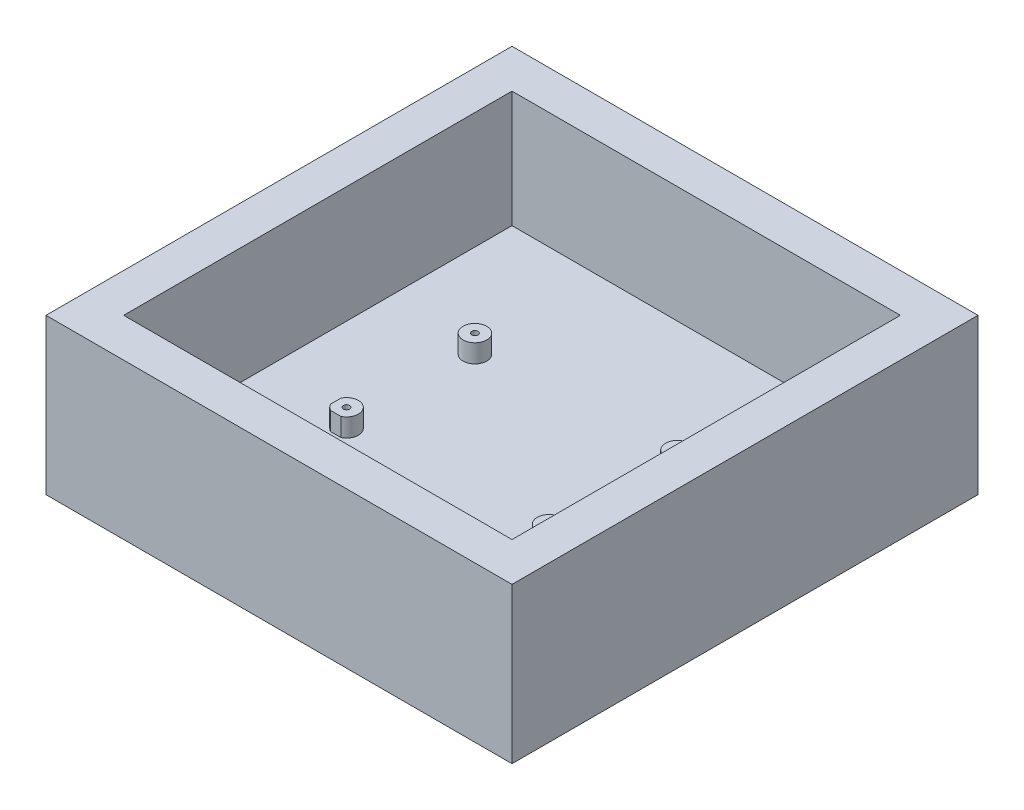
ISO-10303-21;
HEADER;
FILE_DESCRIPTION(('STEP AP214'),'2;1');
FILE_NAME('part.step','',(''),(''),'','','');
FILE_SCHEMA(('AUTOMOTIVE_DESIGN { 1 0 10303 214 1 1 1 1 }'));
ENDSEC;
DATA;
#1=APPLICATION_CONTEXT('core data for automotive mechanical design processes');
#2=APPLICATION_PROTOCOL_DEFINITION('international standard','automotive_design',2000,#1);
#3=PRODUCT_CONTEXT('',#1,'mechanical');
#4=PRODUCT('Part','Part','',(#3));
#5=PRODUCT_RELATED_PRODUCT_CATEGORY('part','',(#4));
#6=PRODUCT_DEFINITION_FORMATION('','',#4);
#7=PRODUCT_DEFINITION_CONTEXT('part definition',#1,'design');
#8=PRODUCT_DEFINITION('design','',#6,#7);
#9=PRODUCT_DEFINITION_SHAPE('','',#8);
#10=(LENGTH_UNIT() NAMED_UNIT(*) SI_UNIT(.MILLI.,.METRE.));
#11=(NAMED_UNIT(*) PLANE_ANGLE_UNIT() SI_UNIT($,.RADIAN.));
#12=(NAMED_UNIT(*) SI_UNIT($,.STERADIAN.) SOLID_ANGLE_UNIT());
#13=UNCERTAINTY_MEASURE_WITH_UNIT(LENGTH_MEASURE(1.E-05),#10,'distance_accuracy_value','');
#14=(GEOMETRIC_REPRESENTATION_CONTEXT(3) GLOBAL_UNCERTAINTY_ASSIGNED_CONTEXT((#13)) GLOBAL_UNIT_ASSIGNED_CONTEXT((#10,
#11,#12)) REPRESENTATION_CONTEXT('',''));
#15=CARTESIAN_POINT('',(0.,0.,0.));
#16=DIRECTION('',(0.,0.,1.));
#17=DIRECTION('',(1.,0.,0.));
#18=AXIS2_PLACEMENT_3D('',#15,#16,#17);
#19=CARTESIAN_POINT('',(-11.0771927684467,217.054701441409,152.4));
#20=DIRECTION('',(0.,1.,0.));
#21=DIRECTION('',(0.,0.,1.));
#22=AXIS2_PLACEMENT_3D('',#19,#20,#21);
#23=PLANE('',#22);
#24=CARTESIAN_POINT('',(32.0028071925533,217.054701441409,55.2));
#25=DIRECTION('',(0.,1.,0.));
#26=DIRECTION('',(0.,0.,1.));
#27=AXIS2_PLACEMENT_3D('',#24,#25,#26);
#28=CIRCLE('',#27,3.87779457302715);
#29=CARTESIAN_POINT('',(32.0028071925533,217.054701441409,59.0777945730272));
#30=VERTEX_POINT('',#29);
#31=EDGE_CURVE('E283',#30,#30,#28,.T.);
#32=ORIENTED_EDGE('',*,*,#31,.F.);
#33=EDGE_LOOP('',(#32));
#34=FACE_BOUND('',#33,.T.);
#35=DIRECTION('',(1.,0.,0.));
#36=VECTOR('',#35,1.);
#37=CARTESIAN_POINT('',(-11.0771927684467,217.054701441409,12.7));
#38=LINE('',#37,#36);
#39=CARTESIAN_POINT('',(1.62280723155329,217.054701441409,12.7));
#40=VERTEX_POINT('',#39);
#41=CARTESIAN_POINT('',(128.622807231553,217.054701441409,12.7));
#42=VERTEX_POINT('',#41);
#43=EDGE_CURVE('E360',#40,#42,#38,.T.);
#44=ORIENTED_EDGE('',*,*,#43,.F.);
#45=DIRECTION('',(0.,0.,-1.));
#46=VECTOR('',#45,1.);
#47=CARTESIAN_POINT('',(1.62280723155329,217.054701441409,152.4));
#48=LINE('',#47,#46);
#49=CARTESIAN_POINT('',(1.62280723155329,217.054701441409,139.7));
#50=VERTEX_POINT('',#49);
#51=EDGE_CURVE('E361',#50,#40,#48,.T.);
#52=ORIENTED_EDGE('',*,*,#51,.F.);
#53=DIRECTION('',(1.,0.,0.));
#54=VECTOR('',#53,1.);
#55=CARTESIAN_POINT('',(-11.0771927684467,217.054701441409,139.7));
#56=LINE('',#55,#54);
#57=CARTESIAN_POINT('',(128.622807231553,217.054701441409,139.7));
#58=VERTEX_POINT('',#57);
#59=EDGE_CURVE('E371',#50,#58,#56,.T.);
#60=ORIENTED_EDGE('',*,*,#59,.T.);
#61=DIRECTION('',(0.,0.,-1.));
#62=VECTOR('',#61,1.);
#63=CARTESIAN_POINT('',(128.622807231553,217.054701441409,152.4));
#64=LINE('',#63,#62);
#65=EDGE_CURVE('E366',#58,#42,#64,.T.);
#66=ORIENTED_EDGE('',*,*,#65,.T.);
#67=EDGE_LOOP('',(#44,#52,#60,#66));
#68=FACE_BOUND('',#67,.T.);
#69=CARTESIAN_POINT('',(32.0028071925533,217.054701441409,97.2));
#70=DIRECTION('',(0.,1.,0.));
#71=DIRECTION('',(0.,0.,1.));
#72=AXIS2_PLACEMENT_3D('',#69,#70,#71);
#73=CIRCLE('',#72,3.87779457302715);
#74=CARTESIAN_POINT('',(33.6723253118316,217.054701441409,100.7));
#75=VERTEX_POINT('',#74);
#76=CARTESIAN_POINT('',(28.5028071925533,217.054701441409,95.5304818807216));
#77=VERTEX_POINT('',#76);
#78=EDGE_CURVE('E335',#75,#77,#73,.T.);
#79=ORIENTED_EDGE('',*,*,#78,.F.);
#80=DIRECTION('',(1.,0.,0.));
#81=VECTOR('',#80,1.);
#82=CARTESIAN_POINT('',(0.,217.054701441409,100.7));
#83=LINE('',#82,#81);
#84=CARTESIAN_POINT('',(30.333289073275,217.054701441409,100.7));
#85=VERTEX_POINT('',#84);
#86=EDGE_CURVE('E267',#85,#75,#83,.T.);
#87=ORIENTED_EDGE('',*,*,#86,.F.);
#88=CARTESIAN_POINT('',(28.5028071925533,217.054701441409,98.8695181192784));
#89=VERTEX_POINT('',#88);
#90=EDGE_CURVE('E325',#89,#85,#73,.T.);
#91=ORIENTED_EDGE('',*,*,#90,.F.);
#92=DIRECTION('',(0.,0.,1.));
#93=VECTOR('',#92,1.);
#94=CARTESIAN_POINT('',(28.5028071925533,217.054701441409,0.));
#95=LINE('',#94,#93);
#96=EDGE_CURVE('E338',#77,#89,#95,.T.);
#97=ORIENTED_EDGE('',*,*,#96,.F.);
#98=EDGE_LOOP('',(#79,#87,#91,#97));
#99=FACE_BOUND('',#98,.T.);
#100=CARTESIAN_POINT('',(98.2428072705533,217.054701441409,97.2));
#101=DIRECTION('',(0.,1.,0.));
#102=DIRECTION('',(0.,0.,1.));
#103=AXIS2_PLACEMENT_3D('',#100,#101,#102);
#104=CIRCLE('',#103,3.87779457302715);
#105=CARTESIAN_POINT('',(99.9123253898317,217.054701441409,100.7));
#106=VERTEX_POINT('',#105);
#107=CARTESIAN_POINT('',(101.742807270553,217.054701441409,98.8695181192784));
#108=VERTEX_POINT('',#107);
#109=EDGE_CURVE('E258',#106,#108,#104,.T.);
#110=ORIENTED_EDGE('',*,*,#109,.F.);
#111=DIRECTION('',(1.,0.,0.));
#112=VECTOR('',#111,1.);
#113=CARTESIAN_POINT('',(0.,217.054701441409,100.7));
#114=LINE('',#113,#112);
#115=CARTESIAN_POINT('',(96.5732891512749,217.054701441409,100.7));
#116=VERTEX_POINT('',#115);
#117=EDGE_CURVE('E263',#116,#106,#114,.T.);
#118=ORIENTED_EDGE('',*,*,#117,.F.);
#119=CARTESIAN_POINT('',(101.742807270553,217.054701441409,95.5304818807217));
#120=VERTEX_POINT('',#119);
#121=EDGE_CURVE('E259',#120,#116,#104,.T.);
#122=ORIENTED_EDGE('',*,*,#121,.F.);
#123=DIRECTION('',(0.,0.,1.));
#124=VECTOR('',#123,1.);
#125=CARTESIAN_POINT('',(101.742807270553,217.054701441409,0.));
#126=LINE('',#125,#124);
#127=EDGE_CURVE('E75',#120,#108,#126,.T.);
#128=ORIENTED_EDGE('',*,*,#127,.T.);
#129=EDGE_LOOP('',(#110,#118,#122,#128));
#130=FACE_BOUND('',#129,.T.);
#131=DIRECTION('',(0.,0.,1.));
#132=VECTOR('',#131,1.);
#133=CARTESIAN_POINT('',(101.742807270553,217.054701441409,0.));
#134=LINE('',#133,#132);
#135=CARTESIAN_POINT('',(101.742807270553,217.054701441409,53.5304818807216));
#136=VERTEX_POINT('',#135);
#137=CARTESIAN_POINT('',(101.742807270553,217.054701441409,56.8695181192784));
#138=VERTEX_POINT('',#137);
#139=EDGE_CURVE('E245',#136,#138,#134,.T.);
#140=ORIENTED_EDGE('',*,*,#139,.T.);
#141=CARTESIAN_POINT('',(98.2428072705533,217.054701441409,55.2));
#142=DIRECTION('',(0.,1.,0.));
#143=DIRECTION('',(0.,0.,1.));
#144=AXIS2_PLACEMENT_3D('',#141,#142,#143);
#145=CIRCLE('',#144,3.87779457302718);
#146=CARTESIAN_POINT('',(96.5732891512749,217.054701441409,51.7));
#147=VERTEX_POINT('',#146);
#148=EDGE_CURVE('E296',#147,#138,#145,.T.);
#149=ORIENTED_EDGE('',*,*,#148,.F.);
#150=DIRECTION('',(1.,0.,0.));
#151=VECTOR('',#150,1.);
#152=CARTESIAN_POINT('',(0.,217.054701441409,51.7));
#153=LINE('',#152,#151);
#154=CARTESIAN_POINT('',(99.9123253898317,217.054701441409,51.7));
#155=VERTEX_POINT('',#154);
#156=EDGE_CURVE('E67',#147,#155,#153,.T.);
#157=ORIENTED_EDGE('',*,*,#156,.T.);
#158=EDGE_CURVE('E295',#136,#155,#145,.T.);
#159=ORIENTED_EDGE('',*,*,#158,.F.);
#160=EDGE_LOOP('',(#140,#149,#157,#159));
#161=FACE_BOUND('',#160,.T.);
#162=ADVANCED_FACE('F51',(#34,#68,#99,#130,#161),#23,.T.);
#163=CARTESIAN_POINT('',(-11.0771927684467,255.154701441409,152.4));
#164=DIRECTION('',(0.,-1.,0.));
#165=DIRECTION('',(0.,0.,-1.));
#166=AXIS2_PLACEMENT_3D('',#163,#164,#165);
#167=PLANE('',#166);
#168=DIRECTION('',(-1.,0.,0.));
#169=VECTOR('',#168,1.);
#170=CARTESIAN_POINT('',(-11.0771927684467,255.154701441409,0.));
#171=LINE('',#170,#169);
#172=CARTESIAN_POINT('',(141.322807231553,255.154701441409,0.));
#173=VERTEX_POINT('',#172);
#174=CARTESIAN_POINT('',(-11.0771927684467,255.154701441409,0.));
#175=VERTEX_POINT('',#174);
#176=EDGE_CURVE('E406',#173,#175,#171,.T.);
#177=ORIENTED_EDGE('',*,*,#176,.T.);
#178=DIRECTION('',(0.,0.,-1.));
#179=VECTOR('',#178,1.);
#180=CARTESIAN_POINT('',(-11.0771927684467,255.154701441409,152.4));
#181=LINE('',#180,#179);
#182=CARTESIAN_POINT('',(-11.0771927684467,255.154701441409,152.4));
#183=VERTEX_POINT('',#182);
#184=EDGE_CURVE('E415',#183,#175,#181,.T.);
#185=ORIENTED_EDGE('',*,*,#184,.F.);
#186=DIRECTION('',(-1.,0.,0.));
#187=VECTOR('',#186,1.);
#188=CARTESIAN_POINT('',(-11.0771927684467,255.154701441409,152.4));
#189=LINE('',#188,#187);
#190=CARTESIAN_POINT('',(141.322807231553,255.154701441409,152.4));
#191=VERTEX_POINT('',#190);
#192=EDGE_CURVE('E412',#191,#183,#189,.T.);
#193=ORIENTED_EDGE('',*,*,#192,.F.);
#194=DIRECTION('',(0.,0.,-1.));
#195=VECTOR('',#194,1.);
#196=CARTESIAN_POINT('',(141.322807231553,255.154701441409,152.4));
#197=LINE('',#196,#195);
#198=EDGE_CURVE('E430',#191,#173,#197,.T.);
#199=ORIENTED_EDGE('',*,*,#198,.T.);
#200=EDGE_LOOP('',(#177,#185,#193,#199));
#201=FACE_BOUND('',#200,.T.);
#202=DIRECTION('',(-1.,0.,0.));
#203=VECTOR('',#202,1.);
#204=CARTESIAN_POINT('',(-11.0771927684467,255.154701441409,12.7));
#205=LINE('',#204,#203);
#206=CARTESIAN_POINT('',(128.622807231553,255.154701441409,12.7));
#207=VERTEX_POINT('',#206);
#208=CARTESIAN_POINT('',(1.62280723155329,255.154701441409,12.7));
#209=VERTEX_POINT('',#208);
#210=EDGE_CURVE('E372',#207,#209,#205,.T.);
#211=ORIENTED_EDGE('',*,*,#210,.F.);
#212=DIRECTION('',(0.,0.,-1.));
#213=VECTOR('',#212,1.);
#214=CARTESIAN_POINT('',(128.622807231553,255.154701441409,152.4));
#215=LINE('',#214,#213);
#216=CARTESIAN_POINT('',(128.622807231553,255.154701441409,139.7));
#217=VERTEX_POINT('',#216);
#218=EDGE_CURVE('E379',#217,#207,#215,.T.);
#219=ORIENTED_EDGE('',*,*,#218,.F.);
#220=DIRECTION('',(-1.,0.,0.));
#221=VECTOR('',#220,1.);
#222=CARTESIAN_POINT('',(-11.0771927684467,255.154701441409,139.7));
#223=LINE('',#222,#221);
#224=CARTESIAN_POINT('',(1.62280723155329,255.154701441409,139.7));
#225=VERTEX_POINT('',#224);
#226=EDGE_CURVE('E388',#217,#225,#223,.T.);
#227=ORIENTED_EDGE('',*,*,#226,.T.);
#228=DIRECTION('',(0.,0.,-1.));
#229=VECTOR('',#228,1.);
#230=CARTESIAN_POINT('',(1.62280723155329,255.154701441409,152.4));
#231=LINE('',#230,#229);
#232=EDGE_CURVE('E389',#225,#209,#231,.T.);
#233=ORIENTED_EDGE('',*,*,#232,.T.);
#234=EDGE_LOOP('',(#211,#219,#227,#233));
#235=FACE_BOUND('',#234,.T.);
#236=ADVANCED_FACE('F448',(#201,#235),#167,.F.);
#237=CARTESIAN_POINT('',(-11.0771927684467,255.154701441409,152.4));
#238=DIRECTION('',(1.,0.,0.));
#239=DIRECTION('',(0.,1.,0.));
#240=AXIS2_PLACEMENT_3D('',#237,#238,#239);
#241=PLANE('',#240);
#242=DIRECTION('',(0.,-1.,0.));
#243=VECTOR('',#242,1.);
#244=CARTESIAN_POINT('',(-11.0771927684467,255.154701441409,0.));
#245=LINE('',#244,#243);
#246=CARTESIAN_POINT('',(-11.0771927684467,204.354701441409,0.));
#247=VERTEX_POINT('',#246);
#248=EDGE_CURVE('E365',#175,#247,#245,.T.);
#249=ORIENTED_EDGE('',*,*,#248,.T.);
#250=DIRECTION('',(0.,0.,-1.));
#251=VECTOR('',#250,1.);
#252=CARTESIAN_POINT('',(-11.0771927684467,204.354701441409,152.4));
#253=LINE('',#252,#251);
#254=CARTESIAN_POINT('',(-11.0771927684467,204.354701441409,152.4));
#255=VERTEX_POINT('',#254);
#256=EDGE_CURVE('E11',#255,#247,#253,.T.);
#257=ORIENTED_EDGE('',*,*,#256,.F.);
#258=DIRECTION('',(0.,-1.,0.));
#259=VECTOR('',#258,1.);
#260=CARTESIAN_POINT('',(-11.0771927684467,255.154701441409,152.4));
#261=LINE('',#260,#259);
#262=EDGE_CURVE('E401',#183,#255,#261,.T.);
#263=ORIENTED_EDGE('',*,*,#262,.F.);
#264=ORIENTED_EDGE('',*,*,#184,.T.);
#265=EDGE_LOOP('',(#249,#257,#263,#264));
#266=FACE_BOUND('',#265,.T.);
#267=ADVANCED_FACE('F53',(#266),#241,.F.);
#268=CARTESIAN_POINT('',(-11.0771927684467,204.354701441409,152.4));
#269=DIRECTION('',(0.,1.,0.));
#270=DIRECTION('',(0.,0.,1.));
#271=AXIS2_PLACEMENT_3D('',#268,#269,#270);
#272=PLANE('',#271);
#273=DIRECTION('',(1.,0.,0.));
#274=VECTOR('',#273,1.);
#275=CARTESIAN_POINT('',(-11.0771927684467,204.354701441409,0.));
#276=LINE('',#275,#274);
#277=CARTESIAN_POINT('',(141.322807231553,204.354701441409,0.));
#278=VERTEX_POINT('',#277);
#279=EDGE_CURVE('E419',#247,#278,#276,.T.);
#280=ORIENTED_EDGE('',*,*,#279,.T.);
#281=DIRECTION('',(0.,0.,-1.));
#282=VECTOR('',#281,1.);
#283=CARTESIAN_POINT('',(141.322807231553,204.354701441409,152.4));
#284=LINE('',#283,#282);
#285=CARTESIAN_POINT('',(141.322807231553,204.354701441409,152.4));
#286=VERTEX_POINT('',#285);
#287=EDGE_CURVE('E60',#286,#278,#284,.T.);
#288=ORIENTED_EDGE('',*,*,#287,.F.);
#289=DIRECTION('',(1.,0.,0.));
#290=VECTOR('',#289,1.);
#291=CARTESIAN_POINT('',(-11.0771927684467,204.354701441409,152.4));
#292=LINE('',#291,#290);
#293=EDGE_CURVE('E405',#255,#286,#292,.T.);
#294=ORIENTED_EDGE('',*,*,#293,.F.);
#295=ORIENTED_EDGE('',*,*,#256,.T.);
#296=EDGE_LOOP('',(#280,#288,#294,#295));
#297=FACE_BOUND('',#296,.T.);
#298=ADVANCED_FACE('F456',(#297),#272,.F.);
#299=CARTESIAN_POINT('',(141.322807231553,255.154701441409,152.4));
#300=DIRECTION('',(-1.,0.,0.));
#301=DIRECTION('',(0.,0.,1.));
#302=AXIS2_PLACEMENT_3D('',#299,#300,#301);
#303=PLANE('',#302);
#304=DIRECTION('',(0.,1.,0.));
#305=VECTOR('',#304,1.);
#306=CARTESIAN_POINT('',(141.322807231553,255.154701441409,0.));
#307=LINE('',#306,#305);
#308=EDGE_CURVE('E422',#278,#173,#307,.T.);
#309=ORIENTED_EDGE('',*,*,#308,.T.);
#310=ORIENTED_EDGE('',*,*,#198,.F.);
#311=DIRECTION('',(0.,1.,0.));
#312=VECTOR('',#311,1.);
#313=CARTESIAN_POINT('',(141.322807231553,255.154701441409,152.4));
#314=LINE('',#313,#312);
#315=EDGE_CURVE('E409',#286,#191,#314,.T.);
#316=ORIENTED_EDGE('',*,*,#315,.F.);
#317=ORIENTED_EDGE('',*,*,#287,.T.);
#318=EDGE_LOOP('',(#309,#310,#316,#317));
#319=FACE_BOUND('',#318,.T.);
#320=ADVANCED_FACE('F439',(#319),#303,.F.);
#321=CARTESIAN_POINT('',(0.,0.,152.4));
#322=DIRECTION('',(0.,0.,1.));
#323=DIRECTION('',(1.,0.,0.));
#324=AXIS2_PLACEMENT_3D('',#321,#322,#323);
#325=PLANE('',#324);
#326=ORIENTED_EDGE('',*,*,#262,.T.);
#327=ORIENTED_EDGE('',*,*,#293,.T.);
#328=ORIENTED_EDGE('',*,*,#315,.T.);
#329=ORIENTED_EDGE('',*,*,#192,.T.);
#330=EDGE_LOOP('',(#326,#327,#328,#329));
#331=FACE_BOUND('',#330,.T.);
#332=ADVANCED_FACE('F455',(#331),#325,.T.);
#333=CARTESIAN_POINT('',(0.,0.,0.));
#334=DIRECTION('',(0.,0.,1.));
#335=DIRECTION('',(1.,0.,0.));
#336=AXIS2_PLACEMENT_3D('',#333,#334,#335);
#337=PLANE('',#336);
#338=ORIENTED_EDGE('',*,*,#248,.F.);
#339=ORIENTED_EDGE('',*,*,#176,.F.);
#340=ORIENTED_EDGE('',*,*,#308,.F.);
#341=ORIENTED_EDGE('',*,*,#279,.F.);
#342=EDGE_LOOP('',(#338,#339,#340,#341));
#343=FACE_BOUND('',#342,.T.);
#344=ADVANCED_FACE('F445',(#343),#337,.F.);
#345=CARTESIAN_POINT('',(1.62280723155329,255.154701441409,152.4));
#346=DIRECTION('',(1.,0.,0.));
#347=DIRECTION('',(0.,1.,0.));
#348=AXIS2_PLACEMENT_3D('',#345,#346,#347);
#349=PLANE('',#348);
#350=DIRECTION('',(0.,-1.,0.));
#351=VECTOR('',#350,1.);
#352=CARTESIAN_POINT('',(1.62280723155329,255.154701441409,12.7));
#353=LINE('',#352,#351);
#354=EDGE_CURVE('E356',#209,#40,#353,.T.);
#355=ORIENTED_EDGE('',*,*,#354,.F.);
#356=ORIENTED_EDGE('',*,*,#232,.F.);
#357=DIRECTION('',(0.,-1.,0.));
#358=VECTOR('',#357,1.);
#359=CARTESIAN_POINT('',(1.62280723155329,255.154701441409,139.7));
#360=LINE('',#359,#358);
#361=EDGE_CURVE('E367',#225,#50,#360,.T.);
#362=ORIENTED_EDGE('',*,*,#361,.T.);
#363=ORIENTED_EDGE('',*,*,#51,.T.);
#364=EDGE_LOOP('',(#355,#356,#362,#363));
#365=FACE_BOUND('',#364,.T.);
#366=ADVANCED_FACE('F476',(#365),#349,.T.);
#367=CARTESIAN_POINT('',(128.622807231553,255.154701441409,152.4));
#368=DIRECTION('',(-1.,0.,0.));
#369=DIRECTION('',(0.,0.,1.));
#370=AXIS2_PLACEMENT_3D('',#367,#368,#369);
#371=PLANE('',#370);
#372=DIRECTION('',(0.,1.,0.));
#373=VECTOR('',#372,1.);
#374=CARTESIAN_POINT('',(128.622807231553,255.154701441409,12.7));
#375=LINE('',#374,#373);
#376=EDGE_CURVE('E375',#42,#207,#375,.T.);
#377=ORIENTED_EDGE('',*,*,#376,.F.);
#378=ORIENTED_EDGE('',*,*,#65,.F.);
#379=DIRECTION('',(0.,1.,0.));
#380=VECTOR('',#379,1.);
#381=CARTESIAN_POINT('',(128.622807231553,255.154701441409,139.7));
#382=LINE('',#381,#380);
#383=EDGE_CURVE('E382',#58,#217,#382,.T.);
#384=ORIENTED_EDGE('',*,*,#383,.T.);
#385=ORIENTED_EDGE('',*,*,#218,.T.);
#386=EDGE_LOOP('',(#377,#378,#384,#385));
#387=FACE_BOUND('',#386,.T.);
#388=ADVANCED_FACE('F478',(#387),#371,.T.);
#389=CARTESIAN_POINT('',(0.,0.,139.7));
#390=DIRECTION('',(0.,0.,1.));
#391=DIRECTION('',(1.,0.,0.));
#392=AXIS2_PLACEMENT_3D('',#389,#390,#391);
#393=PLANE('',#392);
#394=ORIENTED_EDGE('',*,*,#361,.F.);
#395=ORIENTED_EDGE('',*,*,#226,.F.);
#396=ORIENTED_EDGE('',*,*,#383,.F.);
#397=ORIENTED_EDGE('',*,*,#59,.F.);
#398=EDGE_LOOP('',(#394,#395,#396,#397));
#399=FACE_BOUND('',#398,.T.);
#400=ADVANCED_FACE('F481',(#399),#393,.F.);
#401=CARTESIAN_POINT('',(0.,0.,12.7));
#402=DIRECTION('',(0.,0.,1.));
#403=DIRECTION('',(1.,0.,0.));
#404=AXIS2_PLACEMENT_3D('',#401,#402,#403);
#405=PLANE('',#404);
#406=ORIENTED_EDGE('',*,*,#354,.T.);
#407=ORIENTED_EDGE('',*,*,#43,.T.);
#408=ORIENTED_EDGE('',*,*,#376,.T.);
#409=ORIENTED_EDGE('',*,*,#210,.T.);
#410=EDGE_LOOP('',(#406,#407,#408,#409));
#411=FACE_BOUND('',#410,.T.);
#412=ADVANCED_FACE('F485',(#411),#405,.T.);
#413=CARTESIAN_POINT('',(0.,223.054701441409,100.7));
#414=DIRECTION('',(0.,0.,-1.));
#415=DIRECTION('',(-1.,0.,0.));
#416=AXIS2_PLACEMENT_3D('',#413,#414,#415);
#417=PLANE('',#416);
#418=ORIENTED_EDGE('',*,*,#86,.T.);
#419=DIRECTION('',(0.,-1.,0.));
#420=VECTOR('',#419,1.);
#421=CARTESIAN_POINT('',(33.6723253118316,223.054701441409,100.7));
#422=LINE('',#421,#420);
#423=CARTESIAN_POINT('',(33.6723253118316,223.054701441409,100.7));
#424=VERTEX_POINT('',#423);
#425=EDGE_CURVE('E353',#424,#75,#422,.T.);
#426=ORIENTED_EDGE('',*,*,#425,.F.);
#427=DIRECTION('',(1.,0.,0.));
#428=VECTOR('',#427,1.);
#429=CARTESIAN_POINT('',(0.,223.054701441409,100.7));
#430=LINE('',#429,#428);
#431=CARTESIAN_POINT('',(30.333289073275,223.054701441409,100.7));
#432=VERTEX_POINT('',#431);
#433=EDGE_CURVE('E320',#432,#424,#430,.T.);
#434=ORIENTED_EDGE('',*,*,#433,.F.);
#435=DIRECTION('',(0.,-1.,0.));
#436=VECTOR('',#435,1.);
#437=CARTESIAN_POINT('',(30.333289073275,223.054701441409,100.7));
#438=LINE('',#437,#436);
#439=EDGE_CURVE('E342',#432,#85,#438,.T.);
#440=ORIENTED_EDGE('',*,*,#439,.T.);
#441=EDGE_LOOP('',(#418,#426,#434,#440));
#442=FACE_BOUND('',#441,.T.);
#443=ADVANCED_FACE('F488',(#442),#417,.F.);
#444=CARTESIAN_POINT('',(32.0028071925533,223.054701441409,97.2));
#445=DIRECTION('',(0.,-1.,0.));
#446=DIRECTION('',(0.,0.,-1.));
#447=AXIS2_PLACEMENT_3D('',#444,#445,#446);
#448=CYLINDRICAL_SURFACE('',#447,3.87779457302715);
#449=ORIENTED_EDGE('',*,*,#78,.T.);
#450=DIRECTION('',(0.,-1.,0.));
#451=VECTOR('',#450,1.);
#452=CARTESIAN_POINT('',(28.5028071925533,223.054701441409,95.5304818807216));
#453=LINE('',#452,#451);
#454=CARTESIAN_POINT('',(28.5028071925533,223.054701441409,95.5304818807216));
#455=VERTEX_POINT('',#454);
#456=EDGE_CURVE('E349',#455,#77,#453,.T.);
#457=ORIENTED_EDGE('',*,*,#456,.F.);
#458=CARTESIAN_POINT('',(32.0028071925533,223.054701441409,97.2));
#459=DIRECTION('',(0.,1.,0.));
#460=DIRECTION('',(0.,0.,1.));
#461=AXIS2_PLACEMENT_3D('',#458,#459,#460);
#462=CIRCLE('',#461,3.87779457302715);
#463=EDGE_CURVE('E324',#424,#455,#462,.T.);
#464=ORIENTED_EDGE('',*,*,#463,.F.);
#465=ORIENTED_EDGE('',*,*,#425,.T.);
#466=EDGE_LOOP('',(#449,#457,#464,#465));
#467=FACE_BOUND('',#466,.T.);
#468=ADVANCED_FACE('F576',(#467),#448,.T.);
#469=CARTESIAN_POINT('',(28.5028071925533,223.054701441409,0.));
#470=DIRECTION('',(1.,0.,0.));
#471=DIRECTION('',(0.,0.,-1.));
#472=AXIS2_PLACEMENT_3D('',#469,#470,#471);
#473=PLANE('',#472);
#474=ORIENTED_EDGE('',*,*,#96,.T.);
#475=DIRECTION('',(0.,-1.,0.));
#476=VECTOR('',#475,1.);
#477=CARTESIAN_POINT('',(28.5028071925533,223.054701441409,98.8695181192784));
#478=LINE('',#477,#476);
#479=CARTESIAN_POINT('',(28.5028071925533,223.054701441409,98.8695181192784));
#480=VERTEX_POINT('',#479);
#481=EDGE_CURVE('E346',#480,#89,#478,.T.);
#482=ORIENTED_EDGE('',*,*,#481,.F.);
#483=DIRECTION('',(0.,0.,1.));
#484=VECTOR('',#483,1.);
#485=CARTESIAN_POINT('',(28.5028071925533,223.054701441409,0.));
#486=LINE('',#485,#484);
#487=EDGE_CURVE('E328',#455,#480,#486,.T.);
#488=ORIENTED_EDGE('',*,*,#487,.F.);
#489=ORIENTED_EDGE('',*,*,#456,.T.);
#490=EDGE_LOOP('',(#474,#482,#488,#489));
#491=FACE_BOUND('',#490,.T.);
#492=ADVANCED_FACE('F574',(#491),#473,.F.);
#493=ORIENTED_EDGE('',*,*,#90,.T.);
#494=ORIENTED_EDGE('',*,*,#439,.F.);
#495=EDGE_CURVE('E329',#480,#432,#462,.T.);
#496=ORIENTED_EDGE('',*,*,#495,.F.);
#497=ORIENTED_EDGE('',*,*,#481,.T.);
#498=EDGE_LOOP('',(#493,#494,#496,#497));
#499=FACE_BOUND('',#498,.T.);
#500=ADVANCED_FACE('F570',(#499),#448,.T.);
#501=CARTESIAN_POINT('',(0.,223.054701441409,0.));
#502=DIRECTION('',(0.,1.,0.));
#503=DIRECTION('',(0.,0.,1.));
#504=AXIS2_PLACEMENT_3D('',#501,#502,#503);
#505=PLANE('',#504);
#506=CARTESIAN_POINT('',(32.0028071925533,223.054701441409,97.2));
#507=DIRECTION('',(0.,1.,0.));
#508=DIRECTION('',(0.,0.,1.));
#509=AXIS2_PLACEMENT_3D('',#506,#507,#508);
#510=CIRCLE('',#509,1.02499999999999);
#511=CARTESIAN_POINT('',(32.0028071925533,223.054701441409,98.225));
#512=VERTEX_POINT('',#511);
#513=EDGE_CURVE('E232',#512,#512,#510,.T.);
#514=ORIENTED_EDGE('',*,*,#513,.F.);
#515=EDGE_LOOP('',(#514));
#516=FACE_BOUND('',#515,.T.);
#517=ORIENTED_EDGE('',*,*,#433,.T.);
#518=ORIENTED_EDGE('',*,*,#463,.T.);
#519=ORIENTED_EDGE('',*,*,#487,.T.);
#520=ORIENTED_EDGE('',*,*,#495,.T.);
#521=EDGE_LOOP('',(#517,#518,#519,#520));
#522=FACE_BOUND('',#521,.T.);
#523=ADVANCED_FACE('F566',(#516,#522),#505,.T.);
#524=CARTESIAN_POINT('',(0.,223.054701441409,100.7));
#525=DIRECTION('',(0.,0.,-1.));
#526=DIRECTION('',(-1.,0.,0.));
#527=AXIS2_PLACEMENT_3D('',#524,#525,#526);
#528=PLANE('',#527);
#529=ORIENTED_EDGE('',*,*,#117,.T.);
#530=DIRECTION('',(0.,-1.,0.));
#531=VECTOR('',#530,1.);
#532=CARTESIAN_POINT('',(99.9123253898317,223.054701441409,100.7));
#533=LINE('',#532,#531);
#534=CARTESIAN_POINT('',(99.9123253898317,223.054701441409,100.7));
#535=VERTEX_POINT('',#534);
#536=EDGE_CURVE('E241',#535,#106,#533,.T.);
#537=ORIENTED_EDGE('',*,*,#536,.F.);
#538=DIRECTION('',(1.,0.,0.));
#539=VECTOR('',#538,1.);
#540=CARTESIAN_POINT('',(0.,223.054701441409,100.7));
#541=LINE('',#540,#539);
#542=CARTESIAN_POINT('',(96.5732891512749,223.054701441409,100.7));
#543=VERTEX_POINT('',#542);
#544=EDGE_CURVE('E275',#543,#535,#541,.T.);
#545=ORIENTED_EDGE('',*,*,#544,.F.);
#546=DIRECTION('',(0.,-1.,0.));
#547=VECTOR('',#546,1.);
#548=CARTESIAN_POINT('',(96.5732891512749,223.054701441409,100.7));
#549=LINE('',#548,#547);
#550=EDGE_CURVE('E251',#543,#116,#549,.T.);
#551=ORIENTED_EDGE('',*,*,#550,.T.);
#552=EDGE_LOOP('',(#529,#537,#545,#551));
#553=FACE_BOUND('',#552,.T.);
#554=ADVANCED_FACE('F569',(#553),#528,.F.);
#555=CARTESIAN_POINT('',(98.2428072705533,223.054701441409,97.2));
#556=DIRECTION('',(0.,-1.,0.));
#557=DIRECTION('',(0.,0.,-1.));
#558=AXIS2_PLACEMENT_3D('',#555,#556,#557);
#559=CYLINDRICAL_SURFACE('',#558,3.87779457302715);
#560=ORIENTED_EDGE('',*,*,#109,.T.);
#561=DIRECTION('',(0.,-1.,0.));
#562=VECTOR('',#561,1.);
#563=CARTESIAN_POINT('',(101.742807270553,223.054701441409,98.8695181192784));
#564=LINE('',#563,#562);
#565=CARTESIAN_POINT('',(101.742807270553,223.054701441409,98.8695181192784));
#566=VERTEX_POINT('',#565);
#567=EDGE_CURVE('E244',#566,#108,#564,.T.);
#568=ORIENTED_EDGE('',*,*,#567,.F.);
#569=CARTESIAN_POINT('',(98.2428072705533,223.054701441409,97.2));
#570=DIRECTION('',(0.,1.,0.));
#571=DIRECTION('',(0.,0.,1.));
#572=AXIS2_PLACEMENT_3D('',#569,#570,#571);
#573=CIRCLE('',#572,3.87779457302715);
#574=EDGE_CURVE('E272',#535,#566,#573,.T.);
#575=ORIENTED_EDGE('',*,*,#574,.F.);
#576=ORIENTED_EDGE('',*,*,#536,.T.);
#577=EDGE_LOOP('',(#560,#568,#575,#576));
#578=FACE_BOUND('',#577,.T.);
#579=ADVANCED_FACE('F602',(#578),#559,.T.);
#580=CARTESIAN_POINT('',(101.742807270553,223.054701441409,0.));
#581=DIRECTION('',(1.,0.,0.));
#582=DIRECTION('',(0.,0.,-1.));
#583=AXIS2_PLACEMENT_3D('',#580,#581,#582);
#584=PLANE('',#583);
#585=ORIENTED_EDGE('',*,*,#127,.F.);
#586=DIRECTION('',(0.,-1.,0.));
#587=VECTOR('',#586,1.);
#588=CARTESIAN_POINT('',(101.742807270553,223.054701441409,95.5304818807217));
#589=LINE('',#588,#587);
#590=CARTESIAN_POINT('',(101.742807270553,223.054701441409,95.5304818807217));
#591=VERTEX_POINT('',#590);
#592=EDGE_CURVE('E248',#591,#120,#589,.T.);
#593=ORIENTED_EDGE('',*,*,#592,.F.);
#594=DIRECTION('',(0.,0.,1.));
#595=VECTOR('',#594,1.);
#596=CARTESIAN_POINT('',(101.742807270553,223.054701441409,0.));
#597=LINE('',#596,#595);
#598=EDGE_CURVE('E268',#591,#566,#597,.T.);
#599=ORIENTED_EDGE('',*,*,#598,.T.);
#600=ORIENTED_EDGE('',*,*,#567,.T.);
#601=EDGE_LOOP('',(#585,#593,#599,#600));
#602=FACE_BOUND('',#601,.T.);
#603=ADVANCED_FACE('F604',(#602),#584,.T.);
#604=ORIENTED_EDGE('',*,*,#121,.T.);
#605=ORIENTED_EDGE('',*,*,#550,.F.);
#606=EDGE_CURVE('E255',#591,#543,#573,.T.);
#607=ORIENTED_EDGE('',*,*,#606,.F.);
#608=ORIENTED_EDGE('',*,*,#592,.T.);
#609=EDGE_LOOP('',(#604,#605,#607,#608));
#610=FACE_BOUND('',#609,.T.);
#611=ADVANCED_FACE('F598',(#610),#559,.T.);
#612=CARTESIAN_POINT('',(0.,223.054701441409,0.));
#613=DIRECTION('',(0.,1.,0.));
#614=DIRECTION('',(0.,0.,1.));
#615=AXIS2_PLACEMENT_3D('',#612,#613,#614);
#616=PLANE('',#615);
#617=CARTESIAN_POINT('',(98.2428072705533,223.054701441409,97.2));
#618=DIRECTION('',(0.,1.,0.));
#619=DIRECTION('',(0.,0.,1.));
#620=AXIS2_PLACEMENT_3D('',#617,#618,#619);
#621=CIRCLE('',#620,1.02499999999998);
#622=CARTESIAN_POINT('',(98.2428072705533,223.054701441409,98.225));
#623=VERTEX_POINT('',#622);
#624=EDGE_CURVE('E224',#623,#623,#621,.T.);
#625=ORIENTED_EDGE('',*,*,#624,.F.);
#626=EDGE_LOOP('',(#625));
#627=FACE_BOUND('',#626,.T.);
#628=ORIENTED_EDGE('',*,*,#544,.T.);
#629=ORIENTED_EDGE('',*,*,#574,.T.);
#630=ORIENTED_EDGE('',*,*,#598,.F.);
#631=ORIENTED_EDGE('',*,*,#606,.T.);
#632=EDGE_LOOP('',(#628,#629,#630,#631));
#633=FACE_BOUND('',#632,.T.);
#634=ADVANCED_FACE('F543',(#627,#633),#616,.T.);
#635=CARTESIAN_POINT('',(101.742807270553,223.054701441409,0.));
#636=DIRECTION('',(1.,0.,0.));
#637=DIRECTION('',(0.,0.,-1.));
#638=AXIS2_PLACEMENT_3D('',#635,#636,#637);
#639=PLANE('',#638);
#640=ORIENTED_EDGE('',*,*,#139,.F.);
#641=DIRECTION('',(0.,-1.,0.));
#642=VECTOR('',#641,1.);
#643=CARTESIAN_POINT('',(101.742807270553,223.054701441409,53.5304818807216));
#644=LINE('',#643,#642);
#645=CARTESIAN_POINT('',(101.742807270553,223.054701441409,53.5304818807216));
#646=VERTEX_POINT('',#645);
#647=EDGE_CURVE('E279',#646,#136,#644,.T.);
#648=ORIENTED_EDGE('',*,*,#647,.F.);
#649=DIRECTION('',(0.,0.,1.));
#650=VECTOR('',#649,1.);
#651=CARTESIAN_POINT('',(101.742807270553,223.054701441409,0.));
#652=LINE('',#651,#650);
#653=CARTESIAN_POINT('',(101.742807270553,223.054701441409,56.8695181192784));
#654=VERTEX_POINT('',#653);
#655=EDGE_CURVE('E310',#646,#654,#652,.T.);
#656=ORIENTED_EDGE('',*,*,#655,.T.);
#657=DIRECTION('',(0.,-1.,0.));
#658=VECTOR('',#657,1.);
#659=CARTESIAN_POINT('',(101.742807270553,223.054701441409,56.8695181192784));
#660=LINE('',#659,#658);
#661=EDGE_CURVE('E289',#654,#138,#660,.T.);
#662=ORIENTED_EDGE('',*,*,#661,.T.);
#663=EDGE_LOOP('',(#640,#648,#656,#662));
#664=FACE_BOUND('',#663,.T.);
#665=ADVANCED_FACE('F520',(#664),#639,.T.);
#666=CARTESIAN_POINT('',(98.2428072705533,223.054701441409,55.2));
#667=DIRECTION('',(0.,-1.,0.));
#668=DIRECTION('',(0.,0.,-1.));
#669=AXIS2_PLACEMENT_3D('',#666,#667,#668);
#670=CYLINDRICAL_SURFACE('',#669,3.87779457302718);
#671=ORIENTED_EDGE('',*,*,#158,.T.);
#672=DIRECTION('',(0.,-1.,0.));
#673=VECTOR('',#672,1.);
#674=CARTESIAN_POINT('',(99.9123253898317,223.054701441409,51.7));
#675=LINE('',#674,#673);
#676=CARTESIAN_POINT('',(99.9123253898317,223.054701441409,51.7));
#677=VERTEX_POINT('',#676);
#678=EDGE_CURVE('E282',#677,#155,#675,.T.);
#679=ORIENTED_EDGE('',*,*,#678,.F.);
#680=CARTESIAN_POINT('',(98.2428072705533,223.054701441409,55.2));
#681=DIRECTION('',(0.,1.,0.));
#682=DIRECTION('',(0.,0.,1.));
#683=AXIS2_PLACEMENT_3D('',#680,#681,#682);
#684=CIRCLE('',#683,3.87779457302718);
#685=EDGE_CURVE('E307',#646,#677,#684,.T.);
#686=ORIENTED_EDGE('',*,*,#685,.F.);
#687=ORIENTED_EDGE('',*,*,#647,.T.);
#688=EDGE_LOOP('',(#671,#679,#686,#687));
#689=FACE_BOUND('',#688,.T.);
#690=ADVANCED_FACE('F535',(#689),#670,.T.);
#691=CARTESIAN_POINT('',(0.,223.054701441409,51.7));
#692=DIRECTION('',(0.,0.,-1.));
#693=DIRECTION('',(-1.,0.,0.));
#694=AXIS2_PLACEMENT_3D('',#691,#692,#693);
#695=PLANE('',#694);
#696=ORIENTED_EDGE('',*,*,#156,.F.);
#697=DIRECTION('',(0.,-1.,0.));
#698=VECTOR('',#697,1.);
#699=CARTESIAN_POINT('',(96.5732891512749,223.054701441409,51.7));
#700=LINE('',#699,#698);
#701=CARTESIAN_POINT('',(96.5732891512749,223.054701441409,51.7));
#702=VERTEX_POINT('',#701);
#703=EDGE_CURVE('E286',#702,#147,#700,.T.);
#704=ORIENTED_EDGE('',*,*,#703,.F.);
#705=DIRECTION('',(1.,0.,0.));
#706=VECTOR('',#705,1.);
#707=CARTESIAN_POINT('',(0.,223.054701441409,51.7));
#708=LINE('',#707,#706);
#709=EDGE_CURVE('E303',#702,#677,#708,.T.);
#710=ORIENTED_EDGE('',*,*,#709,.T.);
#711=ORIENTED_EDGE('',*,*,#678,.T.);
#712=EDGE_LOOP('',(#696,#704,#710,#711));
#713=FACE_BOUND('',#712,.T.);
#714=ADVANCED_FACE('F533',(#713),#695,.T.);
#715=ORIENTED_EDGE('',*,*,#148,.T.);
#716=ORIENTED_EDGE('',*,*,#661,.F.);
#717=EDGE_CURVE('E292',#702,#654,#684,.T.);
#718=ORIENTED_EDGE('',*,*,#717,.F.);
#719=ORIENTED_EDGE('',*,*,#703,.T.);
#720=EDGE_LOOP('',(#715,#716,#718,#719));
#721=FACE_BOUND('',#720,.T.);
#722=ADVANCED_FACE('F526',(#721),#670,.T.);
#723=CARTESIAN_POINT('',(0.,223.054701441409,0.));
#724=DIRECTION('',(0.,1.,0.));
#725=DIRECTION('',(0.,0.,1.));
#726=AXIS2_PLACEMENT_3D('',#723,#724,#725);
#727=PLANE('',#726);
#728=CARTESIAN_POINT('',(98.2428072705533,223.054701441409,55.2));
#729=DIRECTION('',(0.,1.,0.));
#730=DIRECTION('',(0.,0.,1.));
#731=AXIS2_PLACEMENT_3D('',#728,#729,#730);
#732=CIRCLE('',#731,1.02499999999998);
#733=CARTESIAN_POINT('',(98.2428072705533,223.054701441409,56.225));
#734=VERTEX_POINT('',#733);
#735=EDGE_CURVE('E210',#734,#734,#732,.T.);
#736=ORIENTED_EDGE('',*,*,#735,.F.);
#737=EDGE_LOOP('',(#736));
#738=FACE_BOUND('',#737,.T.);
#739=ORIENTED_EDGE('',*,*,#655,.F.);
#740=ORIENTED_EDGE('',*,*,#685,.T.);
#741=ORIENTED_EDGE('',*,*,#709,.F.);
#742=ORIENTED_EDGE('',*,*,#717,.T.);
#743=EDGE_LOOP('',(#739,#740,#741,#742));
#744=FACE_BOUND('',#743,.T.);
#745=ADVANCED_FACE('F531',(#738,#744),#727,.T.);
#746=CARTESIAN_POINT('',(32.0028071925533,223.054701441409,55.2));
#747=DIRECTION('',(0.,-1.,0.));
#748=DIRECTION('',(0.,0.,-1.));
#749=AXIS2_PLACEMENT_3D('',#746,#747,#748);
#750=CYLINDRICAL_SURFACE('',#749,3.87779457302715);
#751=CARTESIAN_POINT('',(32.0028071925533,223.054701441409,55.2));
#752=DIRECTION('',(0.,1.,0.));
#753=DIRECTION('',(0.,0.,1.));
#754=AXIS2_PLACEMENT_3D('',#751,#752,#753);
#755=CIRCLE('',#754,3.87779457302715);
#756=CARTESIAN_POINT('',(32.0028071925533,223.054701441409,59.0777945730272));
#757=VERTEX_POINT('',#756);
#758=EDGE_CURVE('E240',#757,#757,#755,.T.);
#759=ORIENTED_EDGE('',*,*,#758,.F.);
#760=EDGE_LOOP('',(#759));
#761=FACE_BOUND('',#760,.T.);
#762=ORIENTED_EDGE('',*,*,#31,.T.);
#763=EDGE_LOOP('',(#762));
#764=FACE_BOUND('',#763,.T.);
#765=ADVANCED_FACE('F551',(#761,#764),#750,.T.);
#766=CARTESIAN_POINT('',(32.0028071925533,223.054701441409,55.2));
#767=DIRECTION('',(0.,1.,0.));
#768=DIRECTION('',(0.,0.,1.));
#769=AXIS2_PLACEMENT_3D('',#766,#767,#768);
#770=PLANE('',#769);
#771=CARTESIAN_POINT('',(32.0028071925533,223.054701441409,55.2));
#772=DIRECTION('',(0.,1.,0.));
#773=DIRECTION('',(0.,0.,1.));
#774=AXIS2_PLACEMENT_3D('',#771,#772,#773);
#775=CIRCLE('',#774,1.02499999999999);
#776=CARTESIAN_POINT('',(32.0028071925533,223.054701441409,56.225));
#777=VERTEX_POINT('',#776);
#778=EDGE_CURVE('E211',#777,#777,#775,.T.);
#779=ORIENTED_EDGE('',*,*,#778,.F.);
#780=EDGE_LOOP('',(#779));
#781=FACE_BOUND('',#780,.T.);
#782=ORIENTED_EDGE('',*,*,#758,.T.);
#783=EDGE_LOOP('',(#782));
#784=FACE_BOUND('',#783,.T.);
#785=ADVANCED_FACE('F557',(#781,#784),#770,.T.);
#786=CARTESIAN_POINT('',(32.0028071925533,218.054711441409,97.2));
#787=DIRECTION('',(0.,1.,0.));
#788=DIRECTION('',(0.,0.,1.));
#789=AXIS2_PLACEMENT_3D('',#786,#787,#788);
#790=CONICAL_SURFACE('',#789,1.025,1.02974425867667);
#791=CARTESIAN_POINT('',(32.0028071925533,217.438829306905,97.2));
#792=VERTEX_POINT('',#791);
#793=VERTEX_LOOP('',#792);
#794=FACE_BOUND('',#793,.T.);
#795=CARTESIAN_POINT('',(32.0028071925533,218.054711441409,97.2));
#796=DIRECTION('',(0.,1.,0.));
#797=DIRECTION('',(0.,0.,1.));
#798=AXIS2_PLACEMENT_3D('',#795,#796,#797);
#799=CIRCLE('',#798,1.025);
#800=CARTESIAN_POINT('',(32.0028071925533,218.054711441409,98.225));
#801=VERTEX_POINT('',#800);
#802=EDGE_CURVE('E236',#801,#801,#799,.T.);
#803=ORIENTED_EDGE('',*,*,#802,.T.);
#804=EDGE_LOOP('',(#803));
#805=FACE_BOUND('',#804,.T.);
#806=ADVANCED_FACE('F564',(#794,#805),#790,.F.);
#807=CARTESIAN_POINT('',(32.0028071925533,223.054701441409,97.2));
#808=DIRECTION('',(0.,1.,0.));
#809=DIRECTION('',(0.,0.,1.));
#810=AXIS2_PLACEMENT_3D('',#807,#808,#809);
#811=CYLINDRICAL_SURFACE('',#810,1.02499999999999);
#812=ORIENTED_EDGE('',*,*,#802,.F.);
#813=EDGE_LOOP('',(#812));
#814=FACE_BOUND('',#813,.T.);
#815=ORIENTED_EDGE('',*,*,#513,.T.);
#816=EDGE_LOOP('',(#815));
#817=FACE_BOUND('',#816,.T.);
#818=ADVANCED_FACE('F635',(#814,#817),#811,.F.);
#819=CARTESIAN_POINT('',(98.2428072705533,218.054711441409,97.2));
#820=DIRECTION('',(0.,1.,0.));
#821=DIRECTION('',(0.,0.,1.));
#822=AXIS2_PLACEMENT_3D('',#819,#820,#821);
#823=CONICAL_SURFACE('',#822,1.025,1.02974425867667);
#824=CARTESIAN_POINT('',(98.2428072705533,217.438829306905,97.2));
#825=VERTEX_POINT('',#824);
#826=VERTEX_LOOP('',#825);
#827=FACE_BOUND('',#826,.T.);
#828=CARTESIAN_POINT('',(98.2428072705533,218.054711441409,97.2));
#829=DIRECTION('',(0.,1.,0.));
#830=DIRECTION('',(0.,0.,1.));
#831=AXIS2_PLACEMENT_3D('',#828,#829,#830);
#832=CIRCLE('',#831,1.025);
#833=CARTESIAN_POINT('',(98.2428072705533,218.054711441409,98.225));
#834=VERTEX_POINT('',#833);
#835=EDGE_CURVE('E228',#834,#834,#832,.T.);
#836=ORIENTED_EDGE('',*,*,#835,.T.);
#837=EDGE_LOOP('',(#836));
#838=FACE_BOUND('',#837,.T.);
#839=ADVANCED_FACE('F625',(#827,#838),#823,.F.);
#840=CARTESIAN_POINT('',(98.2428072705533,223.054701441409,97.2));
#841=DIRECTION('',(0.,1.,0.));
#842=DIRECTION('',(0.,0.,1.));
#843=AXIS2_PLACEMENT_3D('',#840,#841,#842);
#844=CYLINDRICAL_SURFACE('',#843,1.02499999999999);
#845=ORIENTED_EDGE('',*,*,#835,.F.);
#846=EDGE_LOOP('',(#845));
#847=FACE_BOUND('',#846,.T.);
#848=ORIENTED_EDGE('',*,*,#624,.T.);
#849=EDGE_LOOP('',(#848));
#850=FACE_BOUND('',#849,.T.);
#851=ADVANCED_FACE('F623',(#847,#850),#844,.F.);
#852=CARTESIAN_POINT('',(98.2428072705533,218.054711441409,55.2));
#853=DIRECTION('',(0.,1.,0.));
#854=DIRECTION('',(0.,0.,1.));
#855=AXIS2_PLACEMENT_3D('',#852,#853,#854);
#856=CONICAL_SURFACE('',#855,1.025,1.02974425867667);
#857=CARTESIAN_POINT('',(98.2428072705533,217.438829306905,55.2));
#858=VERTEX_POINT('',#857);
#859=VERTEX_LOOP('',#858);
#860=FACE_BOUND('',#859,.T.);
#861=CARTESIAN_POINT('',(98.2428072705533,218.054711441409,55.2));
#862=DIRECTION('',(0.,1.,0.));
#863=DIRECTION('',(0.,0.,1.));
#864=AXIS2_PLACEMENT_3D('',#861,#862,#863);
#865=CIRCLE('',#864,1.025);
#866=CARTESIAN_POINT('',(98.2428072705533,218.054711441409,56.225));
#867=VERTEX_POINT('',#866);
#868=EDGE_CURVE('E216',#867,#867,#865,.T.);
#869=ORIENTED_EDGE('',*,*,#868,.T.);
#870=EDGE_LOOP('',(#869));
#871=FACE_BOUND('',#870,.T.);
#872=ADVANCED_FACE('F624',(#860,#871),#856,.F.);
#873=CARTESIAN_POINT('',(98.2428072705533,223.054701441409,55.2));
#874=DIRECTION('',(0.,1.,0.));
#875=DIRECTION('',(0.,0.,1.));
#876=AXIS2_PLACEMENT_3D('',#873,#874,#875);
#877=CYLINDRICAL_SURFACE('',#876,1.02499999999999);
#878=ORIENTED_EDGE('',*,*,#868,.F.);
#879=EDGE_LOOP('',(#878));
#880=FACE_BOUND('',#879,.T.);
#881=ORIENTED_EDGE('',*,*,#735,.T.);
#882=EDGE_LOOP('',(#881));
#883=FACE_BOUND('',#882,.T.);
#884=ADVANCED_FACE('F203',(#880,#883),#877,.F.);
#885=CARTESIAN_POINT('',(32.0028071925533,218.054711441409,55.2));
#886=DIRECTION('',(0.,1.,0.));
#887=DIRECTION('',(0.,0.,1.));
#888=AXIS2_PLACEMENT_3D('',#885,#886,#887);
#889=CONICAL_SURFACE('',#888,1.025,1.02974425867667);
#890=CARTESIAN_POINT('',(32.0028071925533,217.438829306905,55.2));
#891=VERTEX_POINT('',#890);
#892=VERTEX_LOOP('',#891);
#893=FACE_BOUND('',#892,.T.);
#894=CARTESIAN_POINT('',(32.0028071925533,218.054711441409,55.2));
#895=DIRECTION('',(0.,1.,0.));
#896=DIRECTION('',(0.,0.,1.));
#897=AXIS2_PLACEMENT_3D('',#894,#895,#896);
#898=CIRCLE('',#897,1.025);
#899=CARTESIAN_POINT('',(32.0028071925533,218.054711441409,56.225));
#900=VERTEX_POINT('',#899);
#901=EDGE_CURVE('E207',#900,#900,#898,.T.);
#902=ORIENTED_EDGE('',*,*,#901,.T.);
#903=EDGE_LOOP('',(#902));
#904=FACE_BOUND('',#903,.T.);
#905=ADVANCED_FACE('F199',(#893,#904),#889,.F.);
#906=CARTESIAN_POINT('',(32.0028071925533,223.054701441409,55.2));
#907=DIRECTION('',(0.,1.,0.));
#908=DIRECTION('',(0.,0.,1.));
#909=AXIS2_PLACEMENT_3D('',#906,#907,#908);
#910=CYLINDRICAL_SURFACE('',#909,1.02499999999999);
#911=ORIENTED_EDGE('',*,*,#901,.F.);
#912=EDGE_LOOP('',(#911));
#913=FACE_BOUND('',#912,.T.);
#914=ORIENTED_EDGE('',*,*,#778,.T.);
#915=EDGE_LOOP('',(#914));
#916=FACE_BOUND('',#915,.T.);
#917=ADVANCED_FACE('F202',(#913,#916),#910,.F.);
#918=CLOSED_SHELL('',(#162,#236,#267,#298,#320,#332,#344,#366,#388,#400,#412,#443,#468,#492,
#500,#523,#554,#579,#603,#611,#634,#665,#690,#714,#722,#745,#765,#785,#806,#818,#839,#851,#872,
#884,#905,#917));
#919=MANIFOLD_SOLID_BREP('B2',#918);
#920=ADVANCED_BREP_SHAPE_REPRESENTATION('',(#18,#919),#14);
#921=SHAPE_DEFINITION_REPRESENTATION(#9,#920);
ENDSEC;
END-ISO-10303-21;
